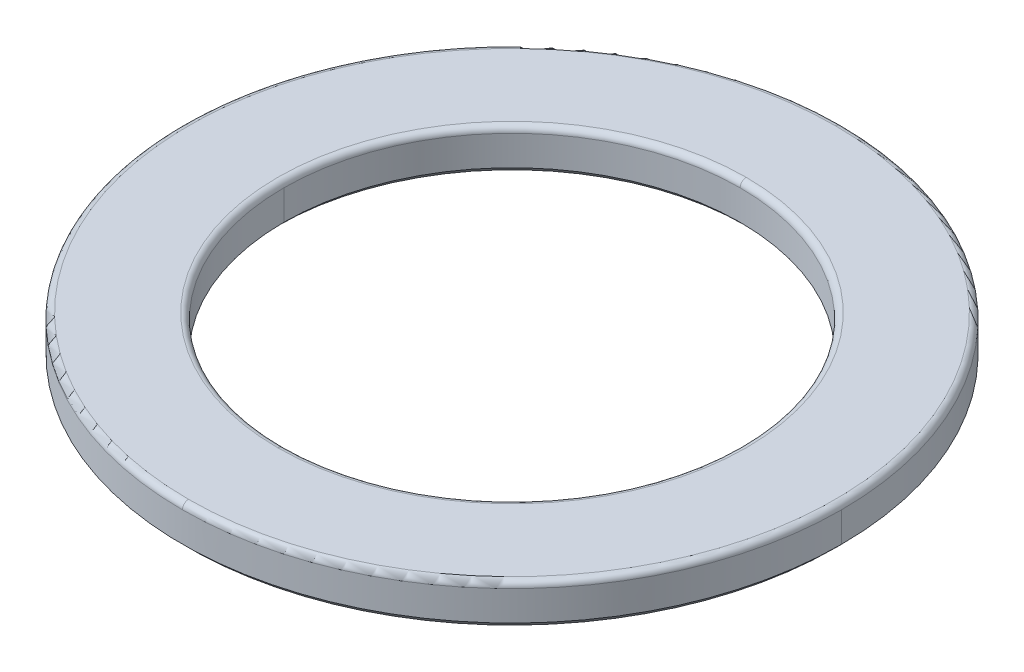
ISO-10303-21;
HEADER;
FILE_DESCRIPTION(('STEP AP214'),'2;1');
FILE_NAME('part.step','',(''),(''),'','','');
FILE_SCHEMA(('AUTOMOTIVE_DESIGN { 1 0 10303 214 1 1 1 1 }'));
ENDSEC;
DATA;
#1=APPLICATION_CONTEXT('core data for automotive mechanical design processes');
#2=APPLICATION_PROTOCOL_DEFINITION('international standard','automotive_design',2000,#1);
#3=PRODUCT_CONTEXT('',#1,'mechanical');
#4=PRODUCT('Part','Part','',(#3));
#5=PRODUCT_RELATED_PRODUCT_CATEGORY('part','',(#4));
#6=PRODUCT_DEFINITION_FORMATION('','',#4);
#7=PRODUCT_DEFINITION_CONTEXT('part definition',#1,'design');
#8=PRODUCT_DEFINITION('design','',#6,#7);
#9=PRODUCT_DEFINITION_SHAPE('','',#8);
#10=(LENGTH_UNIT() NAMED_UNIT(*) SI_UNIT(.MILLI.,.METRE.));
#11=(NAMED_UNIT(*) PLANE_ANGLE_UNIT() SI_UNIT($,.RADIAN.));
#12=(NAMED_UNIT(*) SI_UNIT($,.STERADIAN.) SOLID_ANGLE_UNIT());
#13=UNCERTAINTY_MEASURE_WITH_UNIT(LENGTH_MEASURE(1.E-05),#10,'distance_accuracy_value','');
#14=(GEOMETRIC_REPRESENTATION_CONTEXT(3) GLOBAL_UNCERTAINTY_ASSIGNED_CONTEXT((#13)) GLOBAL_UNIT_ASSIGNED_CONTEXT((#10,
#11,#12)) REPRESENTATION_CONTEXT('',''));
#15=CARTESIAN_POINT('',(0.,0.,0.));
#16=DIRECTION('',(0.,0.,1.));
#17=DIRECTION('',(1.,0.,0.));
#18=AXIS2_PLACEMENT_3D('',#15,#16,#17);
#19=CARTESIAN_POINT('',(0.,13.4,0.));
#20=DIRECTION('',(0.,-1.,0.));
#21=DIRECTION('',(0.,0.,-1.));
#22=AXIS2_PLACEMENT_3D('',#19,#20,#21);
#23=TOROIDAL_SURFACE('',#22,31.9,0.6);
#24=CARTESIAN_POINT('',(0.,13.4,31.9));
#25=DIRECTION('',(1.,0.,0.));
#26=DIRECTION('',(0.,0.,-1.));
#27=AXIS2_PLACEMENT_3D('',#24,#25,#26);
#28=CIRCLE('',#27,0.6);
#29=CARTESIAN_POINT('',(0.,14.,31.9));
#30=VERTEX_POINT('',#29);
#31=CARTESIAN_POINT('',(0.,13.4,32.5));
#32=VERTEX_POINT('',#31);
#33=EDGE_CURVE('E19',#30,#32,#28,.T.);
#34=ORIENTED_EDGE('',*,*,#33,.F.);
#35=CARTESIAN_POINT('',(0.,14.,0.));
#36=DIRECTION('',(0.,-1.,0.));
#37=DIRECTION('',(1.,0.,0.));
#38=AXIS2_PLACEMENT_3D('',#35,#36,#37);
#39=CIRCLE('',#38,31.9);
#40=CARTESIAN_POINT('',(0.,14.,-31.9));
#41=VERTEX_POINT('',#40);
#42=EDGE_CURVE('E159',#30,#41,#39,.T.);
#43=ORIENTED_EDGE('',*,*,#42,.T.);
#44=CARTESIAN_POINT('',(0.,13.4,-31.9));
#45=DIRECTION('',(-1.,0.,0.));
#46=DIRECTION('',(0.,0.,1.));
#47=AXIS2_PLACEMENT_3D('',#44,#45,#46);
#48=CIRCLE('',#47,0.6);
#49=CARTESIAN_POINT('',(0.,13.4,-32.5));
#50=VERTEX_POINT('',#49);
#51=EDGE_CURVE('E248',#41,#50,#48,.T.);
#52=ORIENTED_EDGE('',*,*,#51,.T.);
#53=CARTESIAN_POINT('',(0.,13.4,0.));
#54=DIRECTION('',(0.,-1.,0.));
#55=DIRECTION('',(1.,0.,0.));
#56=AXIS2_PLACEMENT_3D('',#53,#54,#55);
#57=CIRCLE('',#56,32.5);
#58=CARTESIAN_POINT('',(-32.5,13.4,0.));
#59=VERTEX_POINT('',#58);
#60=EDGE_CURVE('E181',#59,#50,#57,.T.);
#61=ORIENTED_EDGE('',*,*,#60,.F.);
#62=CARTESIAN_POINT('',(0.,13.4,0.));
#63=DIRECTION('',(0.,-1.,0.));
#64=DIRECTION('',(1.,0.,0.));
#65=AXIS2_PLACEMENT_3D('',#62,#63,#64);
#66=CIRCLE('',#65,32.5);
#67=EDGE_CURVE('E11',#32,#59,#66,.T.);
#68=ORIENTED_EDGE('',*,*,#67,.F.);
#69=EDGE_LOOP('',(#34,#43,#52,#61,#68));
#70=FACE_BOUND('',#69,.T.);
#71=ADVANCED_FACE('F16',(#70),#23,.T.);
#72=CARTESIAN_POINT('',(0.,11.9288,0.));
#73=DIRECTION('',(0.,1.,0.));
#74=DIRECTION('',(1.,0.,0.));
#75=AXIS2_PLACEMENT_3D('',#72,#73,#74);
#76=CYLINDRICAL_SURFACE('',#75,32.5);
#77=DIRECTION('',(0.,1.,0.));
#78=VECTOR('',#77,1.);
#79=CARTESIAN_POINT('',(-32.5,11.9288,0.));
#80=LINE('',#79,#78);
#81=CARTESIAN_POINT('',(-32.5,10.4576,0.));
#82=VERTEX_POINT('',#81);
#83=EDGE_CURVE('E186',#82,#59,#80,.T.);
#84=ORIENTED_EDGE('',*,*,#83,.F.);
#85=CARTESIAN_POINT('',(0.,10.4576,0.));
#86=DIRECTION('',(0.,-1.,0.));
#87=DIRECTION('',(1.,0.,0.));
#88=AXIS2_PLACEMENT_3D('',#85,#86,#87);
#89=CIRCLE('',#88,32.5);
#90=CARTESIAN_POINT('',(32.5,10.4576,0.));
#91=VERTEX_POINT('',#90);
#92=EDGE_CURVE('E26',#91,#82,#89,.T.);
#93=ORIENTED_EDGE('',*,*,#92,.F.);
#94=DIRECTION('',(0.,1.,0.));
#95=VECTOR('',#94,1.);
#96=CARTESIAN_POINT('',(32.5,11.9288,0.));
#97=LINE('',#96,#95);
#98=CARTESIAN_POINT('',(32.5,13.4,0.));
#99=VERTEX_POINT('',#98);
#100=EDGE_CURVE('E178',#91,#99,#97,.T.);
#101=ORIENTED_EDGE('',*,*,#100,.T.);
#102=CARTESIAN_POINT('',(0.,13.4,0.));
#103=DIRECTION('',(0.,-1.,0.));
#104=DIRECTION('',(1.,0.,0.));
#105=AXIS2_PLACEMENT_3D('',#102,#103,#104);
#106=CIRCLE('',#105,32.5);
#107=EDGE_CURVE('E187',#99,#32,#106,.T.);
#108=ORIENTED_EDGE('',*,*,#107,.T.);
#109=ORIENTED_EDGE('',*,*,#67,.T.);
#110=EDGE_LOOP('',(#84,#93,#101,#108,#109));
#111=FACE_BOUND('',#110,.T.);
#112=ADVANCED_FACE('F318',(#111),#76,.T.);
#113=CARTESIAN_POINT('',(0.,10.1576,0.));
#114=DIRECTION('',(0.,1.,0.));
#115=DIRECTION('',(1.,0.,0.));
#116=AXIS2_PLACEMENT_3D('',#113,#114,#115);
#117=CONICAL_SURFACE('',#116,32.2,0.785398163397448);
#118=DIRECTION('',(-0.707106781186547,0.707106781186548,0.));
#119=VECTOR('',#118,1.);
#120=CARTESIAN_POINT('',(-32.2,10.1576,0.));
#121=LINE('',#120,#119);
#122=CARTESIAN_POINT('',(-31.9,9.8576,0.));
#123=VERTEX_POINT('',#122);
#124=EDGE_CURVE('E235',#123,#82,#121,.T.);
#125=ORIENTED_EDGE('',*,*,#124,.F.);
#126=CARTESIAN_POINT('',(0.,9.8576,0.));
#127=DIRECTION('',(0.,-1.,0.));
#128=DIRECTION('',(1.,0.,0.));
#129=AXIS2_PLACEMENT_3D('',#126,#127,#128);
#130=CIRCLE('',#129,31.9);
#131=CARTESIAN_POINT('',(31.9,9.8576,0.));
#132=VERTEX_POINT('',#131);
#133=EDGE_CURVE('E74',#132,#123,#130,.T.);
#134=ORIENTED_EDGE('',*,*,#133,.F.);
#135=DIRECTION('',(0.707106781186547,0.707106781186548,0.));
#136=VECTOR('',#135,1.);
#137=CARTESIAN_POINT('',(32.2,10.1576,0.));
#138=LINE('',#137,#136);
#139=EDGE_CURVE('E238',#132,#91,#138,.T.);
#140=ORIENTED_EDGE('',*,*,#139,.T.);
#141=ORIENTED_EDGE('',*,*,#92,.T.);
#142=EDGE_LOOP('',(#125,#134,#140,#141));
#143=FACE_BOUND('',#142,.T.);
#144=ADVANCED_FACE('F338',(#143),#117,.T.);
#145=CARTESIAN_POINT('',(30.7716,9.8576,0.));
#146=DIRECTION('',(0.,-1.,0.));
#147=DIRECTION('',(-1.,0.,0.));
#148=AXIS2_PLACEMENT_3D('',#145,#146,#147);
#149=PLANE('',#148);
#150=CARTESIAN_POINT('',(0.,9.8576,0.));
#151=DIRECTION('',(0.,-1.,0.));
#152=DIRECTION('',(1.,0.,0.));
#153=AXIS2_PLACEMENT_3D('',#150,#151,#152);
#154=CIRCLE('',#153,29.6432);
#155=CARTESIAN_POINT('',(0.,9.8576,-29.6432));
#156=VERTEX_POINT('',#155);
#157=CARTESIAN_POINT('',(0.,9.8576,29.6432));
#158=VERTEX_POINT('',#157);
#159=EDGE_CURVE('E223',#156,#158,#154,.T.);
#160=ORIENTED_EDGE('',*,*,#159,.F.);
#161=CARTESIAN_POINT('',(0.,9.8576,0.));
#162=DIRECTION('',(0.,-1.,0.));
#163=DIRECTION('',(1.,0.,0.));
#164=AXIS2_PLACEMENT_3D('',#161,#162,#163);
#165=CIRCLE('',#164,29.6432);
#166=EDGE_CURVE('E195',#158,#156,#165,.T.);
#167=ORIENTED_EDGE('',*,*,#166,.F.);
#168=EDGE_LOOP('',(#160,#167));
#169=FACE_BOUND('',#168,.T.);
#170=ORIENTED_EDGE('',*,*,#133,.T.);
#171=CARTESIAN_POINT('',(0.,9.8576,0.));
#172=DIRECTION('',(0.,-1.,0.));
#173=DIRECTION('',(1.,0.,0.));
#174=AXIS2_PLACEMENT_3D('',#171,#172,#173);
#175=CIRCLE('',#174,31.9);
#176=EDGE_CURVE('E180',#123,#132,#175,.T.);
#177=ORIENTED_EDGE('',*,*,#176,.T.);
#178=EDGE_LOOP('',(#170,#177));
#179=FACE_BOUND('',#178,.T.);
#180=ADVANCED_FACE('F342',(#169,#179),#149,.T.);
#181=CARTESIAN_POINT('',(0.,7.,0.));
#182=DIRECTION('',(0.,-1.,0.));
#183=DIRECTION('',(0.,0.,-1.));
#184=AXIS2_PLACEMENT_3D('',#181,#182,#183);
#185=TOROIDAL_SURFACE('',#184,27.5,3.572);
#186=CARTESIAN_POINT('',(0.,7.,27.5));
#187=DIRECTION('',(1.,0.,0.));
#188=DIRECTION('',(0.,0.,-1.));
#189=AXIS2_PLACEMENT_3D('',#186,#187,#188);
#190=CIRCLE('',#189,3.572);
#191=CARTESIAN_POINT('',(0.,9.8576,25.3568));
#192=VERTEX_POINT('',#191);
#193=EDGE_CURVE('E191',#192,#158,#190,.T.);
#194=ORIENTED_EDGE('',*,*,#193,.F.);
#195=CARTESIAN_POINT('',(0.,9.8576,0.));
#196=DIRECTION('',(0.,-1.,0.));
#197=DIRECTION('',(1.,0.,0.));
#198=AXIS2_PLACEMENT_3D('',#195,#196,#197);
#199=CIRCLE('',#198,25.3568);
#200=CARTESIAN_POINT('',(0.,9.8576,-25.3568));
#201=VERTEX_POINT('',#200);
#202=EDGE_CURVE('E226',#201,#192,#199,.T.);
#203=ORIENTED_EDGE('',*,*,#202,.F.);
#204=CARTESIAN_POINT('',(0.,7.,-27.5));
#205=DIRECTION('',(-1.,0.,0.));
#206=DIRECTION('',(0.,0.,1.));
#207=AXIS2_PLACEMENT_3D('',#204,#205,#206);
#208=CIRCLE('',#207,3.572);
#209=EDGE_CURVE('E210',#201,#156,#208,.T.);
#210=ORIENTED_EDGE('',*,*,#209,.T.);
#211=ORIENTED_EDGE('',*,*,#159,.T.);
#212=EDGE_LOOP('',(#194,#203,#210,#211));
#213=FACE_BOUND('',#212,.T.);
#214=ADVANCED_FACE('F350',(#213),#185,.F.);
#215=CARTESIAN_POINT('',(24.2284,9.8576,0.));
#216=DIRECTION('',(0.,-1.,0.));
#217=DIRECTION('',(0.,0.,-1.));
#218=AXIS2_PLACEMENT_3D('',#215,#216,#217);
#219=PLANE('',#218);
#220=CARTESIAN_POINT('',(0.,9.8576,0.));
#221=DIRECTION('',(0.,-1.,0.));
#222=DIRECTION('',(1.,0.,0.));
#223=AXIS2_PLACEMENT_3D('',#220,#221,#222);
#224=CIRCLE('',#223,23.1);
#225=CARTESIAN_POINT('',(23.1,9.8576,0.));
#226=VERTEX_POINT('',#225);
#227=CARTESIAN_POINT('',(-23.1,9.8576,0.));
#228=VERTEX_POINT('',#227);
#229=EDGE_CURVE('E149',#226,#228,#224,.T.);
#230=ORIENTED_EDGE('',*,*,#229,.F.);
#231=CARTESIAN_POINT('',(0.,9.8576,0.));
#232=DIRECTION('',(0.,-1.,0.));
#233=DIRECTION('',(1.,0.,0.));
#234=AXIS2_PLACEMENT_3D('',#231,#232,#233);
#235=CIRCLE('',#234,23.1);
#236=EDGE_CURVE('E206',#228,#226,#235,.T.);
#237=ORIENTED_EDGE('',*,*,#236,.F.);
#238=EDGE_LOOP('',(#230,#237));
#239=FACE_BOUND('',#238,.T.);
#240=ORIENTED_EDGE('',*,*,#202,.T.);
#241=CARTESIAN_POINT('',(0.,9.8576,0.));
#242=DIRECTION('',(0.,-1.,0.));
#243=DIRECTION('',(1.,0.,0.));
#244=AXIS2_PLACEMENT_3D('',#241,#242,#243);
#245=CIRCLE('',#244,25.3568);
#246=EDGE_CURVE('E196',#192,#201,#245,.T.);
#247=ORIENTED_EDGE('',*,*,#246,.T.);
#248=EDGE_LOOP('',(#240,#247));
#249=FACE_BOUND('',#248,.T.);
#250=ADVANCED_FACE('F271',(#239,#249),#219,.T.);
#251=CARTESIAN_POINT('',(0.,10.1576,0.));
#252=DIRECTION('',(0.,-1.,0.));
#253=DIRECTION('',(1.,0.,0.));
#254=AXIS2_PLACEMENT_3D('',#251,#252,#253);
#255=CONICAL_SURFACE('',#254,22.8,0.785398163397447);
#256=DIRECTION('',(-0.707106781186547,-0.707106781186549,0.));
#257=VECTOR('',#256,1.);
#258=CARTESIAN_POINT('',(-22.8,10.1576,0.));
#259=LINE('',#258,#257);
#260=CARTESIAN_POINT('',(-22.5,10.4576,0.));
#261=VERTEX_POINT('',#260);
#262=EDGE_CURVE('E209',#261,#228,#259,.T.);
#263=ORIENTED_EDGE('',*,*,#262,.F.);
#264=CARTESIAN_POINT('',(0.,10.4576,0.));
#265=DIRECTION('',(0.,-1.,0.));
#266=DIRECTION('',(1.,0.,0.));
#267=AXIS2_PLACEMENT_3D('',#264,#265,#266);
#268=CIRCLE('',#267,22.5);
#269=CARTESIAN_POINT('',(22.5,10.4576,0.));
#270=VERTEX_POINT('',#269);
#271=EDGE_CURVE('E205',#270,#261,#268,.T.);
#272=ORIENTED_EDGE('',*,*,#271,.F.);
#273=DIRECTION('',(0.707106781186547,-0.707106781186549,0.));
#274=VECTOR('',#273,1.);
#275=CARTESIAN_POINT('',(22.8,10.1576,0.));
#276=LINE('',#275,#274);
#277=EDGE_CURVE('E201',#270,#226,#276,.T.);
#278=ORIENTED_EDGE('',*,*,#277,.T.);
#279=ORIENTED_EDGE('',*,*,#229,.T.);
#280=EDGE_LOOP('',(#263,#272,#278,#279));
#281=FACE_BOUND('',#280,.T.);
#282=ADVANCED_FACE('F265',(#281),#255,.F.);
#283=CARTESIAN_POINT('',(0.,11.9288,0.));
#284=DIRECTION('',(0.,1.,0.));
#285=DIRECTION('',(1.,0.,0.));
#286=AXIS2_PLACEMENT_3D('',#283,#284,#285);
#287=CYLINDRICAL_SURFACE('',#286,22.5);
#288=DIRECTION('',(0.,1.,0.));
#289=VECTOR('',#288,1.);
#290=CARTESIAN_POINT('',(-22.5,11.9288,0.));
#291=LINE('',#290,#289);
#292=CARTESIAN_POINT('',(-22.5,13.4,0.));
#293=VERTEX_POINT('',#292);
#294=EDGE_CURVE('E222',#261,#293,#291,.T.);
#295=ORIENTED_EDGE('',*,*,#294,.F.);
#296=CARTESIAN_POINT('',(0.,10.4576,0.));
#297=DIRECTION('',(0.,-1.,0.));
#298=DIRECTION('',(1.,0.,0.));
#299=AXIS2_PLACEMENT_3D('',#296,#297,#298);
#300=CIRCLE('',#299,22.5);
#301=EDGE_CURVE('E207',#261,#270,#300,.T.);
#302=ORIENTED_EDGE('',*,*,#301,.T.);
#303=DIRECTION('',(0.,1.,0.));
#304=VECTOR('',#303,1.);
#305=CARTESIAN_POINT('',(22.5,11.9288,0.));
#306=LINE('',#305,#304);
#307=CARTESIAN_POINT('',(22.5,13.4,0.));
#308=VERTEX_POINT('',#307);
#309=EDGE_CURVE('E163',#270,#308,#306,.T.);
#310=ORIENTED_EDGE('',*,*,#309,.T.);
#311=CARTESIAN_POINT('',(0.,13.4,0.));
#312=DIRECTION('',(0.,-1.,0.));
#313=DIRECTION('',(1.,0.,0.));
#314=AXIS2_PLACEMENT_3D('',#311,#312,#313);
#315=CIRCLE('',#314,22.5);
#316=CARTESIAN_POINT('',(0.,13.4,-22.5));
#317=VERTEX_POINT('',#316);
#318=EDGE_CURVE('E154',#317,#308,#315,.T.);
#319=ORIENTED_EDGE('',*,*,#318,.F.);
#320=CARTESIAN_POINT('',(0.,13.4,0.));
#321=DIRECTION('',(0.,-1.,0.));
#322=DIRECTION('',(1.,0.,0.));
#323=AXIS2_PLACEMENT_3D('',#320,#321,#322);
#324=CIRCLE('',#323,22.5);
#325=EDGE_CURVE('E138',#293,#317,#324,.T.);
#326=ORIENTED_EDGE('',*,*,#325,.F.);
#327=EDGE_LOOP('',(#295,#302,#310,#319,#326));
#328=FACE_BOUND('',#327,.T.);
#329=ADVANCED_FACE('F161',(#328),#287,.F.);
#330=CARTESIAN_POINT('',(0.,13.4,0.));
#331=DIRECTION('',(0.,-1.,0.));
#332=DIRECTION('',(0.,0.,-1.));
#333=AXIS2_PLACEMENT_3D('',#330,#331,#332);
#334=TOROIDAL_SURFACE('',#333,23.1,0.6);
#335=CARTESIAN_POINT('',(0.,13.4,23.1));
#336=DIRECTION('',(1.,0.,0.));
#337=DIRECTION('',(0.,0.,-1.));
#338=AXIS2_PLACEMENT_3D('',#335,#336,#337);
#339=CIRCLE('',#338,0.6);
#340=CARTESIAN_POINT('',(0.,13.4,22.5));
#341=VERTEX_POINT('',#340);
#342=CARTESIAN_POINT('',(0.,14.,23.1));
#343=VERTEX_POINT('',#342);
#344=EDGE_CURVE('E166',#341,#343,#339,.T.);
#345=ORIENTED_EDGE('',*,*,#344,.F.);
#346=CARTESIAN_POINT('',(0.,13.4,0.));
#347=DIRECTION('',(0.,-1.,0.));
#348=DIRECTION('',(1.,0.,0.));
#349=AXIS2_PLACEMENT_3D('',#346,#347,#348);
#350=CIRCLE('',#349,22.5);
#351=EDGE_CURVE('E144',#341,#293,#350,.T.);
#352=ORIENTED_EDGE('',*,*,#351,.T.);
#353=ORIENTED_EDGE('',*,*,#325,.T.);
#354=CARTESIAN_POINT('',(0.,13.4,-23.1));
#355=DIRECTION('',(-1.,0.,0.));
#356=DIRECTION('',(0.,0.,1.));
#357=AXIS2_PLACEMENT_3D('',#354,#355,#356);
#358=CIRCLE('',#357,0.6);
#359=CARTESIAN_POINT('',(0.,14.,-23.1));
#360=VERTEX_POINT('',#359);
#361=EDGE_CURVE('E141',#317,#360,#358,.T.);
#362=ORIENTED_EDGE('',*,*,#361,.T.);
#363=CARTESIAN_POINT('',(0.,14.,0.));
#364=DIRECTION('',(0.,-1.,0.));
#365=DIRECTION('',(1.,0.,0.));
#366=AXIS2_PLACEMENT_3D('',#363,#364,#365);
#367=CIRCLE('',#366,23.1);
#368=EDGE_CURVE('E40',#343,#360,#367,.T.);
#369=ORIENTED_EDGE('',*,*,#368,.F.);
#370=EDGE_LOOP('',(#345,#352,#353,#362,#369));
#371=FACE_BOUND('',#370,.T.);
#372=ADVANCED_FACE('F140',(#371),#334,.T.);
#373=CARTESIAN_POINT('',(27.5,14.,0.));
#374=DIRECTION('',(0.,1.,0.));
#375=DIRECTION('',(0.,0.,-1.));
#376=AXIS2_PLACEMENT_3D('',#373,#374,#375);
#377=PLANE('',#376);
#378=CARTESIAN_POINT('',(0.,14.,0.));
#379=DIRECTION('',(0.,-1.,0.));
#380=DIRECTION('',(1.,0.,0.));
#381=AXIS2_PLACEMENT_3D('',#378,#379,#380);
#382=CIRCLE('',#381,23.1);
#383=EDGE_CURVE('E157',#360,#343,#382,.T.);
#384=ORIENTED_EDGE('',*,*,#383,.T.);
#385=ORIENTED_EDGE('',*,*,#368,.T.);
#386=EDGE_LOOP('',(#384,#385));
#387=FACE_BOUND('',#386,.T.);
#388=CARTESIAN_POINT('',(0.,14.,0.));
#389=DIRECTION('',(0.,-1.,0.));
#390=DIRECTION('',(1.,0.,0.));
#391=AXIS2_PLACEMENT_3D('',#388,#389,#390);
#392=CIRCLE('',#391,31.9);
#393=EDGE_CURVE('E197',#41,#30,#392,.T.);
#394=ORIENTED_EDGE('',*,*,#393,.F.);
#395=ORIENTED_EDGE('',*,*,#42,.F.);
#396=EDGE_LOOP('',(#394,#395));
#397=FACE_BOUND('',#396,.T.);
#398=ADVANCED_FACE('F297',(#387,#397),#377,.T.);
#399=CARTESIAN_POINT('',(0.,13.4,0.));
#400=DIRECTION('',(0.,-1.,0.));
#401=DIRECTION('',(0.,0.,-1.));
#402=AXIS2_PLACEMENT_3D('',#399,#400,#401);
#403=TOROIDAL_SURFACE('',#402,23.1,0.6);
#404=ORIENTED_EDGE('',*,*,#318,.T.);
#405=CARTESIAN_POINT('',(0.,13.4,0.));
#406=DIRECTION('',(0.,-1.,0.));
#407=DIRECTION('',(1.,0.,0.));
#408=AXIS2_PLACEMENT_3D('',#405,#406,#407);
#409=CIRCLE('',#408,22.5);
#410=EDGE_CURVE('E174',#308,#341,#409,.T.);
#411=ORIENTED_EDGE('',*,*,#410,.T.);
#412=ORIENTED_EDGE('',*,*,#344,.T.);
#413=ORIENTED_EDGE('',*,*,#383,.F.);
#414=ORIENTED_EDGE('',*,*,#361,.F.);
#415=EDGE_LOOP('',(#404,#411,#412,#413,#414));
#416=FACE_BOUND('',#415,.T.);
#417=ADVANCED_FACE('F152',(#416),#403,.T.);
#418=CARTESIAN_POINT('',(0.,11.9288,0.));
#419=DIRECTION('',(0.,1.,0.));
#420=DIRECTION('',(1.,0.,0.));
#421=AXIS2_PLACEMENT_3D('',#418,#419,#420);
#422=CYLINDRICAL_SURFACE('',#421,22.5);
#423=ORIENTED_EDGE('',*,*,#271,.T.);
#424=ORIENTED_EDGE('',*,*,#294,.T.);
#425=ORIENTED_EDGE('',*,*,#351,.F.);
#426=ORIENTED_EDGE('',*,*,#410,.F.);
#427=ORIENTED_EDGE('',*,*,#309,.F.);
#428=EDGE_LOOP('',(#423,#424,#425,#426,#427));
#429=FACE_BOUND('',#428,.T.);
#430=ADVANCED_FACE('F278',(#429),#422,.F.);
#431=CARTESIAN_POINT('',(0.,10.1576,0.));
#432=DIRECTION('',(0.,-1.,0.));
#433=DIRECTION('',(1.,0.,0.));
#434=AXIS2_PLACEMENT_3D('',#431,#432,#433);
#435=CONICAL_SURFACE('',#434,22.8,0.785398163397447);
#436=ORIENTED_EDGE('',*,*,#301,.F.);
#437=ORIENTED_EDGE('',*,*,#262,.T.);
#438=ORIENTED_EDGE('',*,*,#236,.T.);
#439=ORIENTED_EDGE('',*,*,#277,.F.);
#440=EDGE_LOOP('',(#436,#437,#438,#439));
#441=FACE_BOUND('',#440,.T.);
#442=ADVANCED_FACE('F276',(#441),#435,.F.);
#443=CARTESIAN_POINT('',(0.,7.,0.));
#444=DIRECTION('',(0.,-1.,0.));
#445=DIRECTION('',(0.,0.,-1.));
#446=AXIS2_PLACEMENT_3D('',#443,#444,#445);
#447=TOROIDAL_SURFACE('',#446,27.5,3.572);
#448=ORIENTED_EDGE('',*,*,#246,.F.);
#449=ORIENTED_EDGE('',*,*,#193,.T.);
#450=ORIENTED_EDGE('',*,*,#166,.T.);
#451=ORIENTED_EDGE('',*,*,#209,.F.);
#452=EDGE_LOOP('',(#448,#449,#450,#451));
#453=FACE_BOUND('',#452,.T.);
#454=ADVANCED_FACE('F330',(#453),#447,.F.);
#455=CARTESIAN_POINT('',(0.,10.1576,0.));
#456=DIRECTION('',(0.,1.,0.));
#457=DIRECTION('',(1.,0.,0.));
#458=AXIS2_PLACEMENT_3D('',#455,#456,#457);
#459=CONICAL_SURFACE('',#458,32.2,0.785398163397448);
#460=ORIENTED_EDGE('',*,*,#176,.F.);
#461=ORIENTED_EDGE('',*,*,#124,.T.);
#462=CARTESIAN_POINT('',(0.,10.4576,0.));
#463=DIRECTION('',(0.,-1.,0.));
#464=DIRECTION('',(1.,0.,0.));
#465=AXIS2_PLACEMENT_3D('',#462,#463,#464);
#466=CIRCLE('',#465,32.5);
#467=EDGE_CURVE('E252',#82,#91,#466,.T.);
#468=ORIENTED_EDGE('',*,*,#467,.T.);
#469=ORIENTED_EDGE('',*,*,#139,.F.);
#470=EDGE_LOOP('',(#460,#461,#468,#469));
#471=FACE_BOUND('',#470,.T.);
#472=ADVANCED_FACE('F322',(#471),#459,.T.);
#473=CARTESIAN_POINT('',(0.,11.9288,0.));
#474=DIRECTION('',(0.,1.,0.));
#475=DIRECTION('',(1.,0.,0.));
#476=AXIS2_PLACEMENT_3D('',#473,#474,#475);
#477=CYLINDRICAL_SURFACE('',#476,32.5);
#478=ORIENTED_EDGE('',*,*,#467,.F.);
#479=ORIENTED_EDGE('',*,*,#83,.T.);
#480=ORIENTED_EDGE('',*,*,#60,.T.);
#481=CARTESIAN_POINT('',(0.,13.4,0.));
#482=DIRECTION('',(0.,-1.,0.));
#483=DIRECTION('',(1.,0.,0.));
#484=AXIS2_PLACEMENT_3D('',#481,#482,#483);
#485=CIRCLE('',#484,32.5);
#486=EDGE_CURVE('E190',#50,#99,#485,.T.);
#487=ORIENTED_EDGE('',*,*,#486,.T.);
#488=ORIENTED_EDGE('',*,*,#100,.F.);
#489=EDGE_LOOP('',(#478,#479,#480,#487,#488));
#490=FACE_BOUND('',#489,.T.);
#491=ADVANCED_FACE('F320',(#490),#477,.T.);
#492=CARTESIAN_POINT('',(0.,13.4,0.));
#493=DIRECTION('',(0.,-1.,0.));
#494=DIRECTION('',(0.,0.,-1.));
#495=AXIS2_PLACEMENT_3D('',#492,#493,#494);
#496=TOROIDAL_SURFACE('',#495,31.9,0.6);
#497=ORIENTED_EDGE('',*,*,#393,.T.);
#498=ORIENTED_EDGE('',*,*,#33,.T.);
#499=ORIENTED_EDGE('',*,*,#107,.F.);
#500=ORIENTED_EDGE('',*,*,#486,.F.);
#501=ORIENTED_EDGE('',*,*,#51,.F.);
#502=EDGE_LOOP('',(#497,#498,#499,#500,#501));
#503=FACE_BOUND('',#502,.T.);
#504=ADVANCED_FACE('F306',(#503),#496,.T.);
#505=CLOSED_SHELL('',(#71,#112,#144,#180,#214,#250,#282,#329,#372,#398,#417,#430,#442,#454,#472,
#491,#504));
#506=MANIFOLD_SOLID_BREP('B1',#505);
#507=ADVANCED_BREP_SHAPE_REPRESENTATION('',(#18,#506),#14);
#508=SHAPE_DEFINITION_REPRESENTATION(#9,#507);
ENDSEC;
END-ISO-10303-21;
